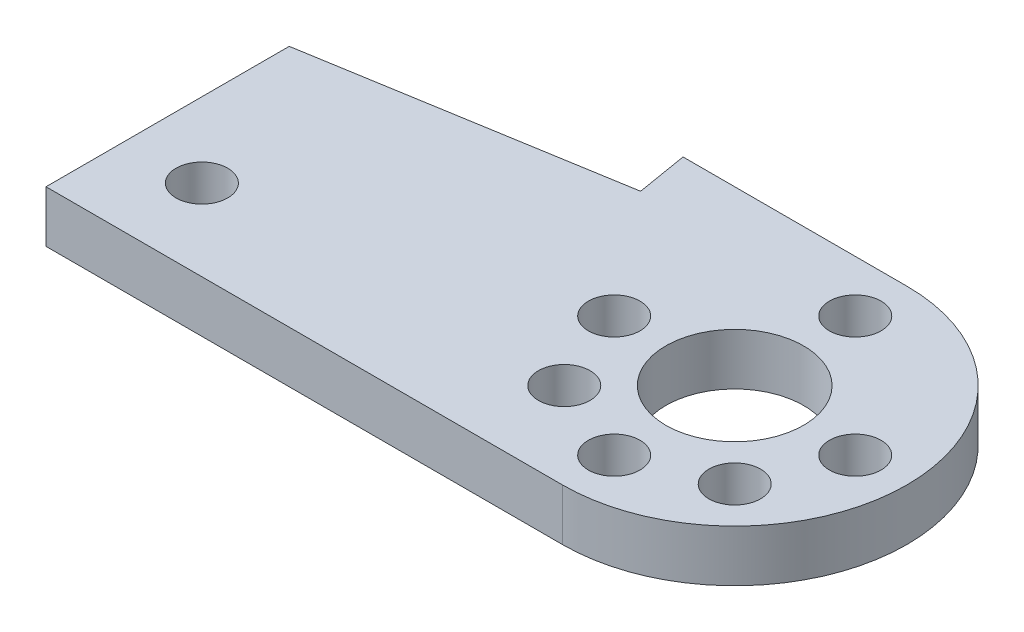
ISO-10303-21;
HEADER;
FILE_DESCRIPTION(('STEP AP214'),'2;1');
FILE_NAME('part.step','',(''),(''),'','','');
FILE_SCHEMA(('AUTOMOTIVE_DESIGN { 1 0 10303 214 1 1 1 1 }'));
ENDSEC;
DATA;
#1=APPLICATION_CONTEXT('core data for automotive mechanical design processes');
#2=APPLICATION_PROTOCOL_DEFINITION('international standard','automotive_design',2000,#1);
#3=PRODUCT_CONTEXT('',#1,'mechanical');
#4=PRODUCT('Part','Part','',(#3));
#5=PRODUCT_RELATED_PRODUCT_CATEGORY('part','',(#4));
#6=PRODUCT_DEFINITION_FORMATION('','',#4);
#7=PRODUCT_DEFINITION_CONTEXT('part definition',#1,'design');
#8=PRODUCT_DEFINITION('design','',#6,#7);
#9=PRODUCT_DEFINITION_SHAPE('','',#8);
#10=(LENGTH_UNIT() NAMED_UNIT(*) SI_UNIT(.MILLI.,.METRE.));
#11=(NAMED_UNIT(*) PLANE_ANGLE_UNIT() SI_UNIT($,.RADIAN.));
#12=(NAMED_UNIT(*) SI_UNIT($,.STERADIAN.) SOLID_ANGLE_UNIT());
#13=UNCERTAINTY_MEASURE_WITH_UNIT(LENGTH_MEASURE(1.E-05),#10,'distance_accuracy_value','');
#14=(GEOMETRIC_REPRESENTATION_CONTEXT(3) GLOBAL_UNCERTAINTY_ASSIGNED_CONTEXT((#13)) GLOBAL_UNIT_ASSIGNED_CONTEXT((#10,
#11,#12)) REPRESENTATION_CONTEXT('',''));
#15=CARTESIAN_POINT('',(0.,0.,0.));
#16=DIRECTION('',(0.,0.,1.));
#17=DIRECTION('',(1.,0.,0.));
#18=AXIS2_PLACEMENT_3D('',#15,#16,#17);
#19=CARTESIAN_POINT('',(0.,3.,0.));
#20=DIRECTION('',(0.,-1.,0.));
#21=DIRECTION('',(0.,0.,-1.));
#22=AXIS2_PLACEMENT_3D('',#19,#20,#21);
#23=CYLINDRICAL_SURFACE('',#22,10.);
#24=CARTESIAN_POINT('',(0.,3.,0.));
#25=DIRECTION('',(0.,1.,0.));
#26=DIRECTION('',(0.,0.,1.));
#27=AXIS2_PLACEMENT_3D('',#24,#25,#26);
#28=CIRCLE('',#27,10.);
#29=CARTESIAN_POINT('',(0.,3.,10.));
#30=VERTEX_POINT('',#29);
#31=CARTESIAN_POINT('',(0.,3.,-10.));
#32=VERTEX_POINT('',#31);
#33=EDGE_CURVE('E11',#30,#32,#28,.T.);
#34=ORIENTED_EDGE('',*,*,#33,.F.);
#35=DIRECTION('',(0.,1.,0.));
#36=VECTOR('',#35,1.);
#37=CARTESIAN_POINT('',(0.,0.,10.));
#38=LINE('',#37,#36);
#39=CARTESIAN_POINT('',(0.,0.,10.));
#40=VERTEX_POINT('',#39);
#41=EDGE_CURVE('E140',#40,#30,#38,.T.);
#42=ORIENTED_EDGE('',*,*,#41,.F.);
#43=CARTESIAN_POINT('',(0.,0.,0.));
#44=DIRECTION('',(0.,1.,0.));
#45=DIRECTION('',(0.,0.,1.));
#46=AXIS2_PLACEMENT_3D('',#43,#44,#45);
#47=CIRCLE('',#46,10.);
#48=CARTESIAN_POINT('',(0.,0.,-10.));
#49=VERTEX_POINT('',#48);
#50=EDGE_CURVE('E45',#40,#49,#47,.T.);
#51=ORIENTED_EDGE('',*,*,#50,.T.);
#52=DIRECTION('',(0.,1.,0.));
#53=VECTOR('',#52,1.);
#54=CARTESIAN_POINT('',(0.,0.,-10.));
#55=LINE('',#54,#53);
#56=EDGE_CURVE('E65',#49,#32,#55,.T.);
#57=ORIENTED_EDGE('',*,*,#56,.T.);
#58=EDGE_LOOP('',(#34,#42,#51,#57));
#59=FACE_BOUND('',#58,.T.);
#60=ADVANCED_FACE('F42',(#59),#23,.T.);
#61=CARTESIAN_POINT('',(0.,3.,0.));
#62=DIRECTION('',(0.,1.,0.));
#63=DIRECTION('',(0.,0.,1.));
#64=AXIS2_PLACEMENT_3D('',#61,#62,#63);
#65=PLANE('',#64);
#66=CARTESIAN_POINT('',(-25.6587236667069,3.,5.28910238643906));
#67=DIRECTION('',(0.,-1.,0.));
#68=DIRECTION('',(0.,0.,-1.));
#69=AXIS2_PLACEMENT_3D('',#66,#67,#68);
#70=CIRCLE('',#69,1.5);
#71=CARTESIAN_POINT('',(-25.6587236667069,3.,3.78910238643906));
#72=VERTEX_POINT('',#71);
#73=EDGE_CURVE('E269',#72,#72,#70,.T.);
#74=ORIENTED_EDGE('',*,*,#73,.T.);
#75=EDGE_LOOP('',(#74));
#76=FACE_BOUND('',#75,.T.);
#77=DIRECTION('',(-0.16439897059201,0.,-0.986393926617701));
#78=VECTOR('',#77,1.);
#79=CARTESIAN_POINT('',(-12.5068030882234,3.,-7.040818220147));
#80=LINE('',#79,#78);
#81=CARTESIAN_POINT('',(-12.5068030882234,3.,-7.040818220147));
#82=VERTEX_POINT('',#81);
#83=CARTESIAN_POINT('',(-12.9999999999994,3.,-10.));
#84=VERTEX_POINT('',#83);
#85=EDGE_CURVE('E57',#82,#84,#80,.T.);
#86=ORIENTED_EDGE('',*,*,#85,.F.);
#87=DIRECTION('',(0.986393926617701,0.,-0.164398970592012));
#88=VECTOR('',#87,1.);
#89=CARTESIAN_POINT('',(-30.,3.,-4.12528570615369));
#90=LINE('',#89,#88);
#91=CARTESIAN_POINT('',(-30.,3.,-4.12528570615369));
#92=VERTEX_POINT('',#91);
#93=EDGE_CURVE('E276',#92,#82,#90,.T.);
#94=ORIENTED_EDGE('',*,*,#93,.F.);
#95=DIRECTION('',(0.,0.,1.));
#96=VECTOR('',#95,1.);
#97=CARTESIAN_POINT('',(-30.,3.,-10.));
#98=LINE('',#97,#96);
#99=CARTESIAN_POINT('',(-30.,3.,10.));
#100=VERTEX_POINT('',#99);
#101=EDGE_CURVE('E113',#92,#100,#98,.T.);
#102=ORIENTED_EDGE('',*,*,#101,.T.);
#103=DIRECTION('',(1.,0.,0.));
#104=VECTOR('',#103,1.);
#105=CARTESIAN_POINT('',(0.,3.,10.));
#106=LINE('',#105,#104);
#107=EDGE_CURVE('E127',#100,#30,#106,.T.);
#108=ORIENTED_EDGE('',*,*,#107,.T.);
#109=ORIENTED_EDGE('',*,*,#33,.T.);
#110=DIRECTION('',(-1.,0.,0.));
#111=VECTOR('',#110,1.);
#112=CARTESIAN_POINT('',(0.,3.,-10.));
#113=LINE('',#112,#111);
#114=EDGE_CURVE('E130',#32,#84,#113,.T.);
#115=ORIENTED_EDGE('',*,*,#114,.T.);
#116=EDGE_LOOP('',(#86,#94,#102,#108,#109,#115));
#117=FACE_BOUND('',#116,.T.);
#118=CARTESIAN_POINT('',(-4.94974746830526,3.,4.94974746830577));
#119=DIRECTION('',(0.,1.,0.));
#120=DIRECTION('',(0.,0.,1.));
#121=AXIS2_PLACEMENT_3D('',#118,#119,#120);
#122=CIRCLE('',#121,1.50000000000031);
#123=CARTESIAN_POINT('',(-4.94974746830526,3.,6.44974746830609));
#124=VERTEX_POINT('',#123);
#125=EDGE_CURVE('E167',#124,#124,#122,.T.);
#126=ORIENTED_EDGE('',*,*,#125,.F.);
#127=EDGE_LOOP('',(#126));
#128=FACE_BOUND('',#127,.T.);
#129=CARTESIAN_POINT('',(4.11599586321522E-13,3.,6.99999999999995));
#130=DIRECTION('',(0.,1.,0.));
#131=DIRECTION('',(0.,0.,1.));
#132=AXIS2_PLACEMENT_3D('',#129,#130,#131);
#133=CIRCLE('',#132,1.49999999999992);
#134=CARTESIAN_POINT('',(4.11599586321522E-13,3.,8.49999999999987));
#135=VERTEX_POINT('',#134);
#136=EDGE_CURVE('E158',#135,#135,#133,.T.);
#137=ORIENTED_EDGE('',*,*,#136,.F.);
#138=EDGE_LOOP('',(#137));
#139=FACE_BOUND('',#138,.T.);
#140=CARTESIAN_POINT('',(4.94974746830608,3.,4.94974746830577));
#141=DIRECTION('',(0.,1.,0.));
#142=DIRECTION('',(0.,0.,1.));
#143=AXIS2_PLACEMENT_3D('',#140,#141,#142);
#144=CIRCLE('',#143,1.49999999999981);
#145=CARTESIAN_POINT('',(4.94974746830608,3.,6.44974746830558));
#146=VERTEX_POINT('',#145);
#147=EDGE_CURVE('E183',#146,#146,#144,.T.);
#148=ORIENTED_EDGE('',*,*,#147,.F.);
#149=EDGE_LOOP('',(#148));
#150=FACE_BOUND('',#149,.T.);
#151=CARTESIAN_POINT('',(4.13947079694738E-13,3.,-6.99999999999922));
#152=DIRECTION('',(0.,1.,0.));
#153=DIRECTION('',(0.,0.,1.));
#154=AXIS2_PLACEMENT_3D('',#151,#152,#153);
#155=CIRCLE('',#154,1.5);
#156=CARTESIAN_POINT('',(4.13947079694738E-13,3.,-5.49999999999922));
#157=VERTEX_POINT('',#156);
#158=EDGE_CURVE('E174',#157,#157,#155,.T.);
#159=ORIENTED_EDGE('',*,*,#158,.F.);
#160=EDGE_LOOP('',(#159));
#161=FACE_BOUND('',#160,.T.);
#162=CARTESIAN_POINT('',(-6.99999999999917,3.,0.));
#163=DIRECTION('',(0.,1.,0.));
#164=DIRECTION('',(0.,0.,1.));
#165=AXIS2_PLACEMENT_3D('',#162,#163,#164);
#166=CIRCLE('',#165,1.50000000000078);
#167=CARTESIAN_POINT('',(-6.99999999999917,3.,1.50000000000077));
#168=VERTEX_POINT('',#167);
#169=EDGE_CURVE('E150',#168,#168,#166,.T.);
#170=ORIENTED_EDGE('',*,*,#169,.F.);
#171=EDGE_LOOP('',(#170));
#172=FACE_BOUND('',#171,.T.);
#173=CARTESIAN_POINT('',(7.,3.,0.));
#174=DIRECTION('',(0.,1.,0.));
#175=DIRECTION('',(0.,0.,1.));
#176=AXIS2_PLACEMENT_3D('',#173,#174,#175);
#177=CIRCLE('',#176,1.5);
#178=CARTESIAN_POINT('',(7.,3.,1.5));
#179=VERTEX_POINT('',#178);
#180=EDGE_CURVE('E178',#179,#179,#177,.T.);
#181=ORIENTED_EDGE('',*,*,#180,.F.);
#182=EDGE_LOOP('',(#181));
#183=FACE_BOUND('',#182,.T.);
#184=CARTESIAN_POINT('',(0.,3.,0.));
#185=DIRECTION('',(0.,1.,0.));
#186=DIRECTION('',(0.,0.,1.));
#187=AXIS2_PLACEMENT_3D('',#184,#185,#186);
#188=CIRCLE('',#187,4.);
#189=CARTESIAN_POINT('',(0.,3.,4.));
#190=VERTEX_POINT('',#189);
#191=EDGE_CURVE('E194',#190,#190,#188,.T.);
#192=ORIENTED_EDGE('',*,*,#191,.F.);
#193=EDGE_LOOP('',(#192));
#194=FACE_BOUND('',#193,.T.);
#195=ADVANCED_FACE('F208',(#76,#117,#128,#139,#150,#161,#172,#183,#194),#65,.T.);
#196=CARTESIAN_POINT('',(0.,0.,0.));
#197=DIRECTION('',(0.,1.,0.));
#198=DIRECTION('',(0.,0.,1.));
#199=AXIS2_PLACEMENT_3D('',#196,#197,#198);
#200=PLANE('',#199);
#201=CARTESIAN_POINT('',(-25.6587236667069,0.,5.28910238643906));
#202=DIRECTION('',(0.,-1.,0.));
#203=DIRECTION('',(0.,0.,-1.));
#204=AXIS2_PLACEMENT_3D('',#201,#202,#203);
#205=CIRCLE('',#204,1.5);
#206=CARTESIAN_POINT('',(-25.6587236667069,0.,3.78910238643906));
#207=VERTEX_POINT('',#206);
#208=EDGE_CURVE('E272',#207,#207,#205,.T.);
#209=ORIENTED_EDGE('',*,*,#208,.F.);
#210=EDGE_LOOP('',(#209));
#211=FACE_BOUND('',#210,.T.);
#212=CARTESIAN_POINT('',(-4.94974746830526,0.,4.94974746830577));
#213=DIRECTION('',(0.,1.,0.));
#214=DIRECTION('',(0.,0.,1.));
#215=AXIS2_PLACEMENT_3D('',#212,#213,#214);
#216=CIRCLE('',#215,1.50000000000031);
#217=CARTESIAN_POINT('',(-4.94974746830526,0.,6.44974746830609));
#218=VERTEX_POINT('',#217);
#219=EDGE_CURVE('E154',#218,#218,#216,.T.);
#220=ORIENTED_EDGE('',*,*,#219,.T.);
#221=EDGE_LOOP('',(#220));
#222=FACE_BOUND('',#221,.T.);
#223=CARTESIAN_POINT('',(4.11599586321522E-13,0.,6.99999999999995));
#224=DIRECTION('',(0.,1.,0.));
#225=DIRECTION('',(0.,0.,1.));
#226=AXIS2_PLACEMENT_3D('',#223,#224,#225);
#227=CIRCLE('',#226,1.49999999999992);
#228=CARTESIAN_POINT('',(4.11599586321522E-13,0.,8.49999999999987));
#229=VERTEX_POINT('',#228);
#230=EDGE_CURVE('E163',#229,#229,#227,.T.);
#231=ORIENTED_EDGE('',*,*,#230,.T.);
#232=EDGE_LOOP('',(#231));
#233=FACE_BOUND('',#232,.T.);
#234=CARTESIAN_POINT('',(4.94974746830608,0.,4.94974746830577));
#235=DIRECTION('',(0.,1.,0.));
#236=DIRECTION('',(0.,0.,1.));
#237=AXIS2_PLACEMENT_3D('',#234,#235,#236);
#238=CIRCLE('',#237,1.49999999999981);
#239=CARTESIAN_POINT('',(4.94974746830608,0.,6.44974746830558));
#240=VERTEX_POINT('',#239);
#241=EDGE_CURVE('E162',#240,#240,#238,.T.);
#242=ORIENTED_EDGE('',*,*,#241,.T.);
#243=EDGE_LOOP('',(#242));
#244=FACE_BOUND('',#243,.T.);
#245=CARTESIAN_POINT('',(4.13947079694738E-13,0.,-6.99999999999922));
#246=DIRECTION('',(0.,1.,0.));
#247=DIRECTION('',(0.,0.,1.));
#248=AXIS2_PLACEMENT_3D('',#245,#246,#247);
#249=CIRCLE('',#248,1.5);
#250=CARTESIAN_POINT('',(4.13947079694738E-13,0.,-5.49999999999922));
#251=VERTEX_POINT('',#250);
#252=EDGE_CURVE('E179',#251,#251,#249,.T.);
#253=ORIENTED_EDGE('',*,*,#252,.T.);
#254=EDGE_LOOP('',(#253));
#255=FACE_BOUND('',#254,.T.);
#256=CARTESIAN_POINT('',(-6.99999999999917,0.,0.));
#257=DIRECTION('',(0.,1.,0.));
#258=DIRECTION('',(0.,0.,1.));
#259=AXIS2_PLACEMENT_3D('',#256,#257,#258);
#260=CIRCLE('',#259,1.50000000000078);
#261=CARTESIAN_POINT('',(-6.99999999999917,0.,1.50000000000077));
#262=VERTEX_POINT('',#261);
#263=EDGE_CURVE('E144',#262,#262,#260,.T.);
#264=ORIENTED_EDGE('',*,*,#263,.T.);
#265=EDGE_LOOP('',(#264));
#266=FACE_BOUND('',#265,.T.);
#267=CARTESIAN_POINT('',(7.,0.,0.));
#268=DIRECTION('',(0.,1.,0.));
#269=DIRECTION('',(0.,0.,1.));
#270=AXIS2_PLACEMENT_3D('',#267,#268,#269);
#271=CIRCLE('',#270,1.5);
#272=CARTESIAN_POINT('',(7.,0.,1.5));
#273=VERTEX_POINT('',#272);
#274=EDGE_CURVE('E190',#273,#273,#271,.T.);
#275=ORIENTED_EDGE('',*,*,#274,.T.);
#276=EDGE_LOOP('',(#275));
#277=FACE_BOUND('',#276,.T.);
#278=CARTESIAN_POINT('',(0.,0.,0.));
#279=DIRECTION('',(0.,1.,0.));
#280=DIRECTION('',(0.,0.,1.));
#281=AXIS2_PLACEMENT_3D('',#278,#279,#280);
#282=CIRCLE('',#281,4.);
#283=CARTESIAN_POINT('',(0.,0.,4.));
#284=VERTEX_POINT('',#283);
#285=EDGE_CURVE('E198',#284,#284,#282,.T.);
#286=ORIENTED_EDGE('',*,*,#285,.T.);
#287=EDGE_LOOP('',(#286));
#288=FACE_BOUND('',#287,.T.);
#289=DIRECTION('',(0.986393926617701,0.,-0.164398970592012));
#290=VECTOR('',#289,1.);
#291=CARTESIAN_POINT('',(-30.,0.,-4.12528570615369));
#292=LINE('',#291,#290);
#293=CARTESIAN_POINT('',(-30.,0.,-4.12528570615369));
#294=VERTEX_POINT('',#293);
#295=CARTESIAN_POINT('',(-12.5068030882234,0.,-7.040818220147));
#296=VERTEX_POINT('',#295);
#297=EDGE_CURVE('E93',#294,#296,#292,.T.);
#298=ORIENTED_EDGE('',*,*,#297,.T.);
#299=DIRECTION('',(-0.16439897059201,0.,-0.986393926617701));
#300=VECTOR('',#299,1.);
#301=CARTESIAN_POINT('',(-12.5068030882234,0.,-7.040818220147));
#302=LINE('',#301,#300);
#303=CARTESIAN_POINT('',(-12.9999999999994,0.,-10.));
#304=VERTEX_POINT('',#303);
#305=EDGE_CURVE('E105',#296,#304,#302,.T.);
#306=ORIENTED_EDGE('',*,*,#305,.T.);
#307=DIRECTION('',(-1.,0.,0.));
#308=VECTOR('',#307,1.);
#309=CARTESIAN_POINT('',(0.,0.,-10.));
#310=LINE('',#309,#308);
#311=EDGE_CURVE('E121',#49,#304,#310,.T.);
#312=ORIENTED_EDGE('',*,*,#311,.F.);
#313=ORIENTED_EDGE('',*,*,#50,.F.);
#314=DIRECTION('',(1.,0.,0.));
#315=VECTOR('',#314,1.);
#316=CARTESIAN_POINT('',(0.,0.,10.));
#317=LINE('',#316,#315);
#318=CARTESIAN_POINT('',(-30.,0.,10.));
#319=VERTEX_POINT('',#318);
#320=EDGE_CURVE('E119',#319,#40,#317,.T.);
#321=ORIENTED_EDGE('',*,*,#320,.F.);
#322=DIRECTION('',(0.,0.,1.));
#323=VECTOR('',#322,1.);
#324=CARTESIAN_POINT('',(-30.,0.,-10.));
#325=LINE('',#324,#323);
#326=EDGE_CURVE('E111',#294,#319,#325,.T.);
#327=ORIENTED_EDGE('',*,*,#326,.F.);
#328=EDGE_LOOP('',(#298,#306,#312,#313,#321,#327));
#329=FACE_BOUND('',#328,.T.);
#330=ADVANCED_FACE('F117',(#211,#222,#233,#244,#255,#266,#277,#288,#329),#200,.F.);
#331=CARTESIAN_POINT('',(0.,0.,0.));
#332=DIRECTION('',(0.,1.,0.));
#333=DIRECTION('',(0.,0.,1.));
#334=AXIS2_PLACEMENT_3D('',#331,#332,#333);
#335=CYLINDRICAL_SURFACE('',#334,4.);
#336=ORIENTED_EDGE('',*,*,#285,.F.);
#337=EDGE_LOOP('',(#336));
#338=FACE_BOUND('',#337,.T.);
#339=ORIENTED_EDGE('',*,*,#191,.T.);
#340=EDGE_LOOP('',(#339));
#341=FACE_BOUND('',#340,.T.);
#342=ADVANCED_FACE('F206',(#338,#341),#335,.F.);
#343=CARTESIAN_POINT('',(7.,0.,0.));
#344=DIRECTION('',(0.,1.,0.));
#345=DIRECTION('',(0.,0.,1.));
#346=AXIS2_PLACEMENT_3D('',#343,#344,#345);
#347=CYLINDRICAL_SURFACE('',#346,1.5);
#348=ORIENTED_EDGE('',*,*,#274,.F.);
#349=EDGE_LOOP('',(#348));
#350=FACE_BOUND('',#349,.T.);
#351=ORIENTED_EDGE('',*,*,#180,.T.);
#352=EDGE_LOOP('',(#351));
#353=FACE_BOUND('',#352,.T.);
#354=ADVANCED_FACE('F222',(#350,#353),#347,.F.);
#355=CARTESIAN_POINT('',(-6.99999999999917,0.,0.));
#356=DIRECTION('',(0.,1.,0.));
#357=DIRECTION('',(0.,0.,1.));
#358=AXIS2_PLACEMENT_3D('',#355,#356,#357);
#359=CYLINDRICAL_SURFACE('',#358,1.50000000000078);
#360=ORIENTED_EDGE('',*,*,#263,.F.);
#361=EDGE_LOOP('',(#360));
#362=FACE_BOUND('',#361,.T.);
#363=ORIENTED_EDGE('',*,*,#169,.T.);
#364=EDGE_LOOP('',(#363));
#365=FACE_BOUND('',#364,.T.);
#366=ADVANCED_FACE('F226',(#362,#365),#359,.F.);
#367=CARTESIAN_POINT('',(4.13947079694738E-13,0.,-6.99999999999922));
#368=DIRECTION('',(0.,1.,0.));
#369=DIRECTION('',(0.,0.,1.));
#370=AXIS2_PLACEMENT_3D('',#367,#368,#369);
#371=CYLINDRICAL_SURFACE('',#370,1.5);
#372=ORIENTED_EDGE('',*,*,#252,.F.);
#373=EDGE_LOOP('',(#372));
#374=FACE_BOUND('',#373,.T.);
#375=ORIENTED_EDGE('',*,*,#158,.T.);
#376=EDGE_LOOP('',(#375));
#377=FACE_BOUND('',#376,.T.);
#378=ADVANCED_FACE('F232',(#374,#377),#371,.F.);
#379=CARTESIAN_POINT('',(4.94974746830608,0.,4.94974746830577));
#380=DIRECTION('',(0.,1.,0.));
#381=DIRECTION('',(0.,0.,1.));
#382=AXIS2_PLACEMENT_3D('',#379,#380,#381);
#383=CYLINDRICAL_SURFACE('',#382,1.49999999999981);
#384=ORIENTED_EDGE('',*,*,#241,.F.);
#385=EDGE_LOOP('',(#384));
#386=FACE_BOUND('',#385,.T.);
#387=ORIENTED_EDGE('',*,*,#147,.T.);
#388=EDGE_LOOP('',(#387));
#389=FACE_BOUND('',#388,.T.);
#390=ADVANCED_FACE('F228',(#386,#389),#383,.F.);
#391=CARTESIAN_POINT('',(4.11599586321522E-13,0.,6.99999999999995));
#392=DIRECTION('',(0.,1.,0.));
#393=DIRECTION('',(0.,0.,1.));
#394=AXIS2_PLACEMENT_3D('',#391,#392,#393);
#395=CYLINDRICAL_SURFACE('',#394,1.49999999999992);
#396=ORIENTED_EDGE('',*,*,#230,.F.);
#397=EDGE_LOOP('',(#396));
#398=FACE_BOUND('',#397,.T.);
#399=ORIENTED_EDGE('',*,*,#136,.T.);
#400=EDGE_LOOP('',(#399));
#401=FACE_BOUND('',#400,.T.);
#402=ADVANCED_FACE('F231',(#398,#401),#395,.F.);
#403=CARTESIAN_POINT('',(-4.94974746830526,0.,4.94974746830577));
#404=DIRECTION('',(0.,1.,0.));
#405=DIRECTION('',(0.,0.,1.));
#406=AXIS2_PLACEMENT_3D('',#403,#404,#405);
#407=CYLINDRICAL_SURFACE('',#406,1.50000000000031);
#408=ORIENTED_EDGE('',*,*,#219,.F.);
#409=EDGE_LOOP('',(#408));
#410=FACE_BOUND('',#409,.T.);
#411=ORIENTED_EDGE('',*,*,#125,.T.);
#412=EDGE_LOOP('',(#411));
#413=FACE_BOUND('',#412,.T.);
#414=ADVANCED_FACE('F237',(#410,#413),#407,.F.);
#415=CARTESIAN_POINT('',(0.,0.,10.));
#416=DIRECTION('',(0.,0.,1.));
#417=DIRECTION('',(1.,0.,0.));
#418=AXIS2_PLACEMENT_3D('',#415,#416,#417);
#419=PLANE('',#418);
#420=ORIENTED_EDGE('',*,*,#107,.F.);
#421=DIRECTION('',(0.,1.,0.));
#422=VECTOR('',#421,1.);
#423=CARTESIAN_POINT('',(-30.,0.,10.));
#424=LINE('',#423,#422);
#425=EDGE_CURVE('E145',#319,#100,#424,.T.);
#426=ORIENTED_EDGE('',*,*,#425,.F.);
#427=ORIENTED_EDGE('',*,*,#320,.T.);
#428=ORIENTED_EDGE('',*,*,#41,.T.);
#429=EDGE_LOOP('',(#420,#426,#427,#428));
#430=FACE_BOUND('',#429,.T.);
#431=ADVANCED_FACE('F240',(#430),#419,.T.);
#432=CARTESIAN_POINT('',(-30.,0.,-10.));
#433=DIRECTION('',(-1.,0.,0.));
#434=DIRECTION('',(0.,0.,1.));
#435=AXIS2_PLACEMENT_3D('',#432,#433,#434);
#436=PLANE('',#435);
#437=DIRECTION('',(0.,1.,0.));
#438=VECTOR('',#437,1.);
#439=CARTESIAN_POINT('',(-30.,0.,-4.12528570615369));
#440=LINE('',#439,#438);
#441=EDGE_CURVE('E97',#294,#92,#440,.T.);
#442=ORIENTED_EDGE('',*,*,#441,.F.);
#443=ORIENTED_EDGE('',*,*,#326,.T.);
#444=ORIENTED_EDGE('',*,*,#425,.T.);
#445=ORIENTED_EDGE('',*,*,#101,.F.);
#446=EDGE_LOOP('',(#442,#443,#444,#445));
#447=FACE_BOUND('',#446,.T.);
#448=ADVANCED_FACE('F109',(#447),#436,.T.);
#449=CARTESIAN_POINT('',(0.,0.,-10.));
#450=DIRECTION('',(0.,0.,-1.));
#451=DIRECTION('',(-1.,0.,0.));
#452=AXIS2_PLACEMENT_3D('',#449,#450,#451);
#453=PLANE('',#452);
#454=DIRECTION('',(0.,1.,0.));
#455=VECTOR('',#454,1.);
#456=CARTESIAN_POINT('',(-12.9999999999994,0.,-10.));
#457=LINE('',#456,#455);
#458=EDGE_CURVE('E134',#304,#84,#457,.T.);
#459=ORIENTED_EDGE('',*,*,#458,.T.);
#460=ORIENTED_EDGE('',*,*,#114,.F.);
#461=ORIENTED_EDGE('',*,*,#56,.F.);
#462=ORIENTED_EDGE('',*,*,#311,.T.);
#463=EDGE_LOOP('',(#459,#460,#461,#462));
#464=FACE_BOUND('',#463,.T.);
#465=ADVANCED_FACE('F248',(#464),#453,.T.);
#466=CARTESIAN_POINT('',(-12.5068030882234,0.,-7.040818220147));
#467=DIRECTION('',(0.986393926617701,0.,-0.16439897059201));
#468=DIRECTION('',(-0.16439897059201,0.,-0.986393926617702));
#469=AXIS2_PLACEMENT_3D('',#466,#467,#468);
#470=PLANE('',#469);
#471=ORIENTED_EDGE('',*,*,#85,.T.);
#472=ORIENTED_EDGE('',*,*,#458,.F.);
#473=ORIENTED_EDGE('',*,*,#305,.F.);
#474=DIRECTION('',(0.,1.,0.));
#475=VECTOR('',#474,1.);
#476=CARTESIAN_POINT('',(-12.5068030882234,0.,-7.040818220147));
#477=LINE('',#476,#475);
#478=EDGE_CURVE('E99',#296,#82,#477,.T.);
#479=ORIENTED_EDGE('',*,*,#478,.T.);
#480=EDGE_LOOP('',(#471,#472,#473,#479));
#481=FACE_BOUND('',#480,.T.);
#482=ADVANCED_FACE('F251',(#481),#470,.F.);
#483=CARTESIAN_POINT('',(-30.,0.,-4.12528570615369));
#484=DIRECTION('',(0.164398970592012,0.,0.986393926617701));
#485=DIRECTION('',(0.986393926617701,0.,-0.164398970592012));
#486=AXIS2_PLACEMENT_3D('',#483,#484,#485);
#487=PLANE('',#486);
#488=ORIENTED_EDGE('',*,*,#93,.T.);
#489=ORIENTED_EDGE('',*,*,#478,.F.);
#490=ORIENTED_EDGE('',*,*,#297,.F.);
#491=ORIENTED_EDGE('',*,*,#441,.T.);
#492=EDGE_LOOP('',(#488,#489,#490,#491));
#493=FACE_BOUND('',#492,.T.);
#494=ADVANCED_FACE('F96',(#493),#487,.F.);
#495=CARTESIAN_POINT('',(-25.6587236667069,3.,5.28910238643906));
#496=DIRECTION('',(0.,-1.,0.));
#497=DIRECTION('',(0.,0.,-1.));
#498=AXIS2_PLACEMENT_3D('',#495,#496,#497);
#499=CYLINDRICAL_SURFACE('',#498,1.5);
#500=ORIENTED_EDGE('',*,*,#73,.F.);
#501=EDGE_LOOP('',(#500));
#502=FACE_BOUND('',#501,.T.);
#503=ORIENTED_EDGE('',*,*,#208,.T.);
#504=EDGE_LOOP('',(#503));
#505=FACE_BOUND('',#504,.T.);
#506=ADVANCED_FACE('F260',(#502,#505),#499,.F.);
#507=CLOSED_SHELL('',(#60,#195,#330,#342,#354,#366,#378,#390,#402,#414,#431,#448,#465,#482,#494,#506));
#508=MANIFOLD_SOLID_BREP('B2',#507);
#509=ADVANCED_BREP_SHAPE_REPRESENTATION('',(#18,#508),#14);
#510=SHAPE_DEFINITION_REPRESENTATION(#9,#509);
ENDSEC;
END-ISO-10303-21;
